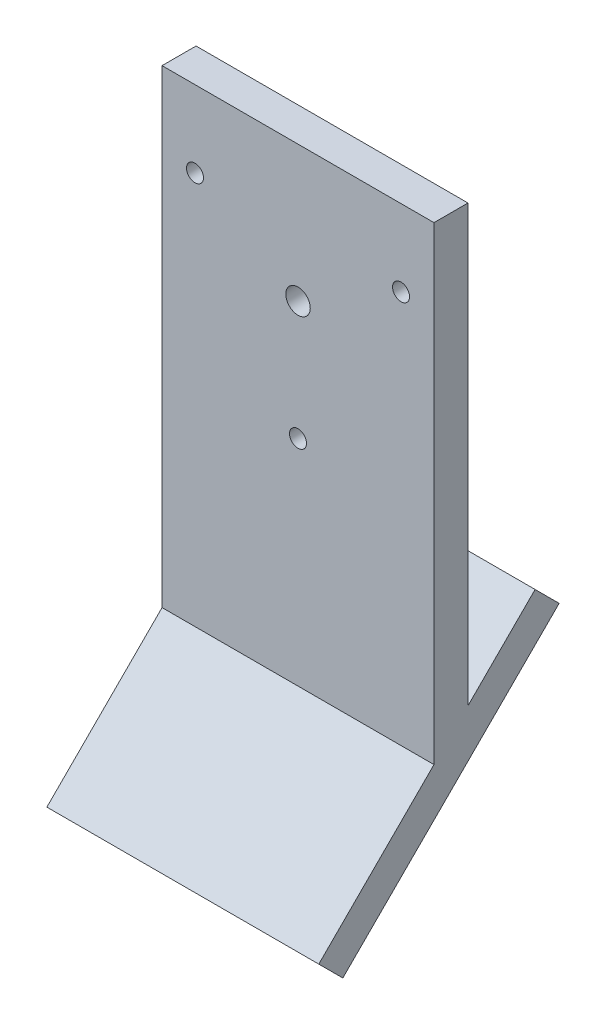
ISO-10303-21;
HEADER;
FILE_DESCRIPTION(('STEP AP214'),'2;1');
FILE_NAME('part.step','',(''),(''),'','','');
FILE_SCHEMA(('AUTOMOTIVE_DESIGN { 1 0 10303 214 1 1 1 1 }'));
ENDSEC;
DATA;
#1=APPLICATION_CONTEXT('core data for automotive mechanical design processes');
#2=APPLICATION_PROTOCOL_DEFINITION('international standard','automotive_design',2000,#1);
#3=PRODUCT_CONTEXT('',#1,'mechanical');
#4=PRODUCT('Part','Part','',(#3));
#5=PRODUCT_RELATED_PRODUCT_CATEGORY('part','',(#4));
#6=PRODUCT_DEFINITION_FORMATION('','',#4);
#7=PRODUCT_DEFINITION_CONTEXT('part definition',#1,'design');
#8=PRODUCT_DEFINITION('design','',#6,#7);
#9=PRODUCT_DEFINITION_SHAPE('','',#8);
#10=(LENGTH_UNIT() NAMED_UNIT(*) SI_UNIT(.MILLI.,.METRE.));
#11=(NAMED_UNIT(*) PLANE_ANGLE_UNIT() SI_UNIT($,.RADIAN.));
#12=(NAMED_UNIT(*) SI_UNIT($,.STERADIAN.) SOLID_ANGLE_UNIT());
#13=UNCERTAINTY_MEASURE_WITH_UNIT(LENGTH_MEASURE(1.E-05),#10,'distance_accuracy_value','');
#14=(GEOMETRIC_REPRESENTATION_CONTEXT(3) GLOBAL_UNCERTAINTY_ASSIGNED_CONTEXT((#13)) GLOBAL_UNIT_ASSIGNED_CONTEXT((#10,
#11,#12)) REPRESENTATION_CONTEXT('',''));
#15=CARTESIAN_POINT('',(0.,0.,0.));
#16=DIRECTION('',(0.,0.,1.));
#17=DIRECTION('',(1.,0.,0.));
#18=AXIS2_PLACEMENT_3D('',#15,#16,#17);
#19=CARTESIAN_POINT('',(20.,73.6133636546301,2.5));
#20=DIRECTION('',(0.,0.,-1.));
#21=DIRECTION('',(0.,1.,0.));
#22=AXIS2_PLACEMENT_3D('',#19,#20,#21);
#23=PLANE('',#22);
#24=CARTESIAN_POINT('',(15.1554445662277,62.3633636546301,2.49999999999999));
#25=DIRECTION('',(0.,0.,1.));
#26=DIRECTION('',(1.,0.,0.));
#27=AXIS2_PLACEMENT_3D('',#24,#25,#26);
#28=CIRCLE('',#27,1.24999999999999);
#29=CARTESIAN_POINT('',(16.4054445662277,62.3633636546301,2.49999999999999));
#30=VERTEX_POINT('',#29);
#31=EDGE_CURVE('E191',#30,#30,#28,.T.);
#32=ORIENTED_EDGE('',*,*,#31,.F.);
#33=EDGE_LOOP('',(#32));
#34=FACE_BOUND('',#33,.T.);
#35=CARTESIAN_POINT('',(0.,36.1133636546301,2.49999999999999));
#36=DIRECTION('',(0.,0.,1.));
#37=DIRECTION('',(1.,0.,0.));
#38=AXIS2_PLACEMENT_3D('',#35,#36,#37);
#39=CIRCLE('',#38,1.24999999999999);
#40=CARTESIAN_POINT('',(1.24999999999999,36.1133636546301,2.49999999999999));
#41=VERTEX_POINT('',#40);
#42=EDGE_CURVE('E185',#41,#41,#39,.T.);
#43=ORIENTED_EDGE('',*,*,#42,.F.);
#44=EDGE_LOOP('',(#43));
#45=FACE_BOUND('',#44,.T.);
#46=DIRECTION('',(0.,-1.,0.));
#47=VECTOR('',#46,1.);
#48=CARTESIAN_POINT('',(-20.,73.6133636546301,2.5));
#49=LINE('',#48,#47);
#50=CARTESIAN_POINT('',(-20.,73.6133636546301,2.5));
#51=VERTEX_POINT('',#50);
#52=CARTESIAN_POINT('',(-20.,4.57106781186549,2.49999999999999));
#53=VERTEX_POINT('',#52);
#54=EDGE_CURVE('E84',#51,#53,#49,.T.);
#55=ORIENTED_EDGE('',*,*,#54,.T.);
#56=DIRECTION('',(-1.,0.,0.));
#57=VECTOR('',#56,1.);
#58=CARTESIAN_POINT('',(20.,4.57106781186549,2.49999999999999));
#59=LINE('',#58,#57);
#60=CARTESIAN_POINT('',(20.,4.57106781186549,2.49999999999999));
#61=VERTEX_POINT('',#60);
#62=EDGE_CURVE('E127',#61,#53,#59,.T.);
#63=ORIENTED_EDGE('',*,*,#62,.F.);
#64=DIRECTION('',(0.,-1.,0.));
#65=VECTOR('',#64,1.);
#66=CARTESIAN_POINT('',(20.,73.6133636546301,2.5));
#67=LINE('',#66,#65);
#68=CARTESIAN_POINT('',(20.,73.6133636546301,2.5));
#69=VERTEX_POINT('',#68);
#70=EDGE_CURVE('E115',#69,#61,#67,.T.);
#71=ORIENTED_EDGE('',*,*,#70,.F.);
#72=DIRECTION('',(-1.,0.,0.));
#73=VECTOR('',#72,1.);
#74=CARTESIAN_POINT('',(20.,73.6133636546301,2.5));
#75=LINE('',#74,#73);
#76=EDGE_CURVE('E122',#69,#51,#75,.T.);
#77=ORIENTED_EDGE('',*,*,#76,.T.);
#78=EDGE_LOOP('',(#55,#63,#71,#77));
#79=FACE_BOUND('',#78,.T.);
#80=CARTESIAN_POINT('',(-15.1554445662277,62.3633636546301,2.49999999999999));
#81=DIRECTION('',(0.,0.,1.));
#82=DIRECTION('',(1.,0.,0.));
#83=AXIS2_PLACEMENT_3D('',#80,#81,#82);
#84=CIRCLE('',#83,1.24999999999999);
#85=CARTESIAN_POINT('',(-13.9054445662277,62.3633636546301,2.49999999999999));
#86=VERTEX_POINT('',#85);
#87=EDGE_CURVE('E197',#86,#86,#84,.T.);
#88=ORIENTED_EDGE('',*,*,#87,.F.);
#89=EDGE_LOOP('',(#88));
#90=FACE_BOUND('',#89,.T.);
#91=CARTESIAN_POINT('',(0.,53.6133636546301,2.49999999999999));
#92=DIRECTION('',(0.,0.,1.));
#93=DIRECTION('',(1.,0.,0.));
#94=AXIS2_PLACEMENT_3D('',#91,#92,#93);
#95=CIRCLE('',#94,1.8);
#96=CARTESIAN_POINT('',(1.8,53.6133636546301,2.49999999999999));
#97=VERTEX_POINT('',#96);
#98=EDGE_CURVE('E203',#97,#97,#95,.T.);
#99=ORIENTED_EDGE('',*,*,#98,.F.);
#100=EDGE_LOOP('',(#99));
#101=FACE_BOUND('',#100,.T.);
#102=ADVANCED_FACE('F38',(#34,#45,#79,#90,#101),#23,.F.);
#103=CARTESIAN_POINT('',(20.,-12.3743686707647,19.44543648263));
#104=DIRECTION('',(0.,0.707106781186552,-0.707106781186543));
#105=DIRECTION('',(0.,0.707106781186543,0.707106781186552));
#106=AXIS2_PLACEMENT_3D('',#103,#104,#105);
#107=PLANE('',#106);
#108=DIRECTION('',(0.,-0.707106781186543,-0.707106781186552));
#109=VECTOR('',#108,1.);
#110=CARTESIAN_POINT('',(-20.,-12.3743686707647,19.44543648263));
#111=LINE('',#110,#109);
#112=CARTESIAN_POINT('',(-20.,-12.3743686707647,19.44543648263));
#113=VERTEX_POINT('',#112);
#114=CARTESIAN_POINT('',(-20.,-15.9099025766974,15.9099025766972));
#115=VERTEX_POINT('',#114);
#116=EDGE_CURVE('E135',#113,#115,#111,.T.);
#117=ORIENTED_EDGE('',*,*,#116,.T.);
#118=DIRECTION('',(-1.,0.,0.));
#119=VECTOR('',#118,1.);
#120=CARTESIAN_POINT('',(20.,-15.9099025766974,15.9099025766972));
#121=LINE('',#120,#119);
#122=CARTESIAN_POINT('',(20.,-15.9099025766974,15.9099025766972));
#123=VERTEX_POINT('',#122);
#124=EDGE_CURVE('E11',#123,#115,#121,.T.);
#125=ORIENTED_EDGE('',*,*,#124,.F.);
#126=DIRECTION('',(0.,-0.707106781186543,-0.707106781186552));
#127=VECTOR('',#126,1.);
#128=CARTESIAN_POINT('',(20.,-12.3743686707647,19.44543648263));
#129=LINE('',#128,#127);
#130=CARTESIAN_POINT('',(20.,-12.3743686707647,19.44543648263));
#131=VERTEX_POINT('',#130);
#132=EDGE_CURVE('E150',#131,#123,#129,.T.);
#133=ORIENTED_EDGE('',*,*,#132,.F.);
#134=DIRECTION('',(-1.,0.,0.));
#135=VECTOR('',#134,1.);
#136=CARTESIAN_POINT('',(20.,-12.3743686707647,19.44543648263));
#137=LINE('',#136,#135);
#138=EDGE_CURVE('E131',#131,#113,#137,.T.);
#139=ORIENTED_EDGE('',*,*,#138,.T.);
#140=EDGE_LOOP('',(#117,#125,#133,#139));
#141=FACE_BOUND('',#140,.T.);
#142=ADVANCED_FACE('F40',(#141),#107,.F.);
#143=CARTESIAN_POINT('',(20.,-15.9099025766974,15.9099025766972));
#144=DIRECTION('',(0.,0.707106781186544,0.707106781186551));
#145=DIRECTION('',(0.,-0.707106781186551,0.707106781186544));
#146=AXIS2_PLACEMENT_3D('',#143,#144,#145);
#147=PLANE('',#146);
#148=DIRECTION('',(0.,0.707106781186551,-0.707106781186544));
#149=VECTOR('',#148,1.);
#150=CARTESIAN_POINT('',(-20.,-15.9099025766974,15.9099025766972));
#151=LINE('',#150,#149);
#152=CARTESIAN_POINT('',(-20.,15.9099025766974,-15.9099025766972));
#153=VERTEX_POINT('',#152);
#154=EDGE_CURVE('E138',#115,#153,#151,.T.);
#155=ORIENTED_EDGE('',*,*,#154,.T.);
#156=DIRECTION('',(-1.,0.,0.));
#157=VECTOR('',#156,1.);
#158=CARTESIAN_POINT('',(20.,15.9099025766974,-15.9099025766972));
#159=LINE('',#158,#157);
#160=CARTESIAN_POINT('',(20.,15.9099025766974,-15.9099025766972));
#161=VERTEX_POINT('',#160);
#162=EDGE_CURVE('E47',#161,#153,#159,.T.);
#163=ORIENTED_EDGE('',*,*,#162,.F.);
#164=DIRECTION('',(0.,0.707106781186551,-0.707106781186544));
#165=VECTOR('',#164,1.);
#166=CARTESIAN_POINT('',(20.,-15.9099025766974,15.9099025766972));
#167=LINE('',#166,#165);
#168=EDGE_CURVE('E98',#123,#161,#167,.T.);
#169=ORIENTED_EDGE('',*,*,#168,.F.);
#170=ORIENTED_EDGE('',*,*,#124,.T.);
#171=EDGE_LOOP('',(#155,#163,#169,#170));
#172=FACE_BOUND('',#171,.T.);
#173=ADVANCED_FACE('F217',(#172),#147,.F.);
#174=CARTESIAN_POINT('',(20.,15.9099025766974,-15.9099025766972));
#175=DIRECTION('',(0.,-0.707106781186549,0.707106781186546));
#176=DIRECTION('',(0.,-0.707106781186546,-0.707106781186549));
#177=AXIS2_PLACEMENT_3D('',#174,#175,#176);
#178=PLANE('',#177);
#179=DIRECTION('',(0.,0.707106781186546,0.707106781186549));
#180=VECTOR('',#179,1.);
#181=CARTESIAN_POINT('',(-20.,15.9099025766974,-15.9099025766972));
#182=LINE('',#181,#180);
#183=CARTESIAN_POINT('',(-20.,19.4454364826301,-12.3743686707645));
#184=VERTEX_POINT('',#183);
#185=EDGE_CURVE('E141',#153,#184,#182,.T.);
#186=ORIENTED_EDGE('',*,*,#185,.T.);
#187=DIRECTION('',(-1.,0.,0.));
#188=VECTOR('',#187,1.);
#189=CARTESIAN_POINT('',(20.,19.4454364826301,-12.3743686707645));
#190=LINE('',#189,#188);
#191=CARTESIAN_POINT('',(20.,19.4454364826301,-12.3743686707645));
#192=VERTEX_POINT('',#191);
#193=EDGE_CURVE('E157',#192,#184,#190,.T.);
#194=ORIENTED_EDGE('',*,*,#193,.F.);
#195=DIRECTION('',(0.,0.707106781186546,0.707106781186549));
#196=VECTOR('',#195,1.);
#197=CARTESIAN_POINT('',(20.,15.9099025766974,-15.9099025766972));
#198=LINE('',#197,#196);
#199=EDGE_CURVE('E165',#161,#192,#198,.T.);
#200=ORIENTED_EDGE('',*,*,#199,.F.);
#201=ORIENTED_EDGE('',*,*,#162,.T.);
#202=EDGE_LOOP('',(#186,#194,#200,#201));
#203=FACE_BOUND('',#202,.T.);
#204=ADVANCED_FACE('F163',(#203),#178,.F.);
#205=CARTESIAN_POINT('',(20.,19.4454364826301,-12.3743686707645));
#206=DIRECTION('',(0.,-0.707106781186543,-0.707106781186552));
#207=DIRECTION('',(0.,0.707106781186552,-0.707106781186543));
#208=AXIS2_PLACEMENT_3D('',#205,#206,#207);
#209=PLANE('',#208);
#210=DIRECTION('',(0.,-0.707106781186552,0.707106781186543));
#211=VECTOR('',#210,1.);
#212=CARTESIAN_POINT('',(-20.,19.4454364826301,-12.3743686707645));
#213=LINE('',#212,#211);
#214=CARTESIAN_POINT('',(-20.,9.57106781186554,-2.5));
#215=VERTEX_POINT('',#214);
#216=EDGE_CURVE('E143',#184,#215,#213,.T.);
#217=ORIENTED_EDGE('',*,*,#216,.T.);
#218=DIRECTION('',(-1.,0.,0.));
#219=VECTOR('',#218,1.);
#220=CARTESIAN_POINT('',(20.,9.57106781186554,-2.5));
#221=LINE('',#220,#219);
#222=CARTESIAN_POINT('',(20.,9.57106781186554,-2.5));
#223=VERTEX_POINT('',#222);
#224=EDGE_CURVE('E154',#223,#215,#221,.T.);
#225=ORIENTED_EDGE('',*,*,#224,.F.);
#226=DIRECTION('',(0.,-0.707106781186552,0.707106781186543));
#227=VECTOR('',#226,1.);
#228=CARTESIAN_POINT('',(20.,19.4454364826301,-12.3743686707645));
#229=LINE('',#228,#227);
#230=EDGE_CURVE('E177',#192,#223,#229,.T.);
#231=ORIENTED_EDGE('',*,*,#230,.F.);
#232=ORIENTED_EDGE('',*,*,#193,.T.);
#233=EDGE_LOOP('',(#217,#225,#231,#232));
#234=FACE_BOUND('',#233,.T.);
#235=ADVANCED_FACE('F173',(#234),#209,.F.);
#236=CARTESIAN_POINT('',(20.,9.57106781186554,-2.5));
#237=DIRECTION('',(0.,0.,1.));
#238=DIRECTION('',(1.,0.,0.));
#239=AXIS2_PLACEMENT_3D('',#236,#237,#238);
#240=PLANE('',#239);
#241=CARTESIAN_POINT('',(0.,53.6133636546301,-2.5));
#242=DIRECTION('',(0.,0.,1.));
#243=DIRECTION('',(1.,0.,0.));
#244=AXIS2_PLACEMENT_3D('',#241,#242,#243);
#245=CIRCLE('',#244,1.8);
#246=CARTESIAN_POINT('',(1.8,53.6133636546301,-2.5));
#247=VERTEX_POINT('',#246);
#248=EDGE_CURVE('E200',#247,#247,#245,.T.);
#249=ORIENTED_EDGE('',*,*,#248,.T.);
#250=EDGE_LOOP('',(#249));
#251=FACE_BOUND('',#250,.T.);
#252=CARTESIAN_POINT('',(-15.1554445662277,62.3633636546301,-2.5));
#253=DIRECTION('',(0.,0.,1.));
#254=DIRECTION('',(1.,0.,0.));
#255=AXIS2_PLACEMENT_3D('',#252,#253,#254);
#256=CIRCLE('',#255,1.24999999999999);
#257=CARTESIAN_POINT('',(-13.9054445662277,62.3633636546301,-2.5));
#258=VERTEX_POINT('',#257);
#259=EDGE_CURVE('E194',#258,#258,#256,.T.);
#260=ORIENTED_EDGE('',*,*,#259,.T.);
#261=EDGE_LOOP('',(#260));
#262=FACE_BOUND('',#261,.T.);
#263=CARTESIAN_POINT('',(15.1554445662277,62.3633636546301,-2.5));
#264=DIRECTION('',(0.,0.,1.));
#265=DIRECTION('',(1.,0.,0.));
#266=AXIS2_PLACEMENT_3D('',#263,#264,#265);
#267=CIRCLE('',#266,1.24999999999999);
#268=CARTESIAN_POINT('',(16.4054445662277,62.3633636546301,-2.5));
#269=VERTEX_POINT('',#268);
#270=EDGE_CURVE('E188',#269,#269,#267,.T.);
#271=ORIENTED_EDGE('',*,*,#270,.T.);
#272=EDGE_LOOP('',(#271));
#273=FACE_BOUND('',#272,.T.);
#274=CARTESIAN_POINT('',(0.,36.1133636546301,-2.5));
#275=DIRECTION('',(0.,0.,1.));
#276=DIRECTION('',(1.,0.,0.));
#277=AXIS2_PLACEMENT_3D('',#274,#275,#276);
#278=CIRCLE('',#277,1.24999999999999);
#279=CARTESIAN_POINT('',(1.25,36.1133636546301,-2.5));
#280=VERTEX_POINT('',#279);
#281=EDGE_CURVE('E139',#280,#280,#278,.T.);
#282=ORIENTED_EDGE('',*,*,#281,.T.);
#283=EDGE_LOOP('',(#282));
#284=FACE_BOUND('',#283,.T.);
#285=DIRECTION('',(0.,1.,0.));
#286=VECTOR('',#285,1.);
#287=CARTESIAN_POINT('',(-20.,9.57106781186554,-2.5));
#288=LINE('',#287,#286);
#289=CARTESIAN_POINT('',(-20.,73.6133636546301,-2.5));
#290=VERTEX_POINT('',#289);
#291=EDGE_CURVE('E145',#215,#290,#288,.T.);
#292=ORIENTED_EDGE('',*,*,#291,.T.);
#293=DIRECTION('',(-1.,0.,0.));
#294=VECTOR('',#293,1.);
#295=CARTESIAN_POINT('',(20.,73.6133636546301,-2.5));
#296=LINE('',#295,#294);
#297=CARTESIAN_POINT('',(20.,73.6133636546301,-2.5));
#298=VERTEX_POINT('',#297);
#299=EDGE_CURVE('E126',#298,#290,#296,.T.);
#300=ORIENTED_EDGE('',*,*,#299,.F.);
#301=DIRECTION('',(0.,1.,0.));
#302=VECTOR('',#301,1.);
#303=CARTESIAN_POINT('',(20.,9.57106781186554,-2.5));
#304=LINE('',#303,#302);
#305=EDGE_CURVE('E117',#223,#298,#304,.T.);
#306=ORIENTED_EDGE('',*,*,#305,.F.);
#307=ORIENTED_EDGE('',*,*,#224,.T.);
#308=EDGE_LOOP('',(#292,#300,#306,#307));
#309=FACE_BOUND('',#308,.T.);
#310=ADVANCED_FACE('F176',(#251,#262,#273,#284,#309),#240,.F.);
#311=CARTESIAN_POINT('',(20.,73.6133636546301,-2.5));
#312=DIRECTION('',(0.,-1.,0.));
#313=DIRECTION('',(0.,0.,-1.));
#314=AXIS2_PLACEMENT_3D('',#311,#312,#313);
#315=PLANE('',#314);
#316=DIRECTION('',(0.,0.,1.));
#317=VECTOR('',#316,1.);
#318=CARTESIAN_POINT('',(-20.,73.6133636546301,-2.5));
#319=LINE('',#318,#317);
#320=EDGE_CURVE('E125',#290,#51,#319,.T.);
#321=ORIENTED_EDGE('',*,*,#320,.T.);
#322=ORIENTED_EDGE('',*,*,#76,.F.);
#323=DIRECTION('',(0.,0.,1.));
#324=VECTOR('',#323,1.);
#325=CARTESIAN_POINT('',(20.,73.6133636546301,-2.5));
#326=LINE('',#325,#324);
#327=EDGE_CURVE('E111',#298,#69,#326,.T.);
#328=ORIENTED_EDGE('',*,*,#327,.F.);
#329=ORIENTED_EDGE('',*,*,#299,.T.);
#330=EDGE_LOOP('',(#321,#322,#328,#329));
#331=FACE_BOUND('',#330,.T.);
#332=ADVANCED_FACE('F123',(#331),#315,.F.);
#333=CARTESIAN_POINT('',(20.,4.57106781186549,2.49999999999999));
#334=DIRECTION('',(0.,-0.707106781186543,-0.707106781186552));
#335=DIRECTION('',(0.,0.707106781186552,-0.707106781186543));
#336=AXIS2_PLACEMENT_3D('',#333,#334,#335);
#337=PLANE('',#336);
#338=DIRECTION('',(0.,-0.707106781186551,0.707106781186543));
#339=VECTOR('',#338,1.);
#340=CARTESIAN_POINT('',(-20.,4.57106781186549,2.49999999999999));
#341=LINE('',#340,#339);
#342=EDGE_CURVE('E90',#53,#113,#341,.T.);
#343=ORIENTED_EDGE('',*,*,#342,.T.);
#344=ORIENTED_EDGE('',*,*,#138,.F.);
#345=DIRECTION('',(0.,-0.707106781186551,0.707106781186543));
#346=VECTOR('',#345,1.);
#347=CARTESIAN_POINT('',(20.,4.57106781186549,2.49999999999999));
#348=LINE('',#347,#346);
#349=EDGE_CURVE('E55',#61,#131,#348,.T.);
#350=ORIENTED_EDGE('',*,*,#349,.F.);
#351=ORIENTED_EDGE('',*,*,#62,.T.);
#352=EDGE_LOOP('',(#343,#344,#350,#351));
#353=FACE_BOUND('',#352,.T.);
#354=ADVANCED_FACE('F223',(#353),#337,.F.);
#355=CARTESIAN_POINT('',(20.,0.,0.));
#356=DIRECTION('',(1.,0.,0.));
#357=DIRECTION('',(0.,0.,-1.));
#358=AXIS2_PLACEMENT_3D('',#355,#356,#357);
#359=PLANE('',#358);
#360=ORIENTED_EDGE('',*,*,#132,.T.);
#361=ORIENTED_EDGE('',*,*,#168,.T.);
#362=ORIENTED_EDGE('',*,*,#199,.T.);
#363=ORIENTED_EDGE('',*,*,#230,.T.);
#364=ORIENTED_EDGE('',*,*,#305,.T.);
#365=ORIENTED_EDGE('',*,*,#327,.T.);
#366=ORIENTED_EDGE('',*,*,#70,.T.);
#367=ORIENTED_EDGE('',*,*,#349,.T.);
#368=EDGE_LOOP('',(#360,#361,#362,#363,#364,#365,#366,#367));
#369=FACE_BOUND('',#368,.T.);
#370=ADVANCED_FACE('F113',(#369),#359,.T.);
#371=CARTESIAN_POINT('',(-20.,0.,0.));
#372=DIRECTION('',(1.,0.,0.));
#373=DIRECTION('',(0.,0.,-1.));
#374=AXIS2_PLACEMENT_3D('',#371,#372,#373);
#375=PLANE('',#374);
#376=ORIENTED_EDGE('',*,*,#116,.F.);
#377=ORIENTED_EDGE('',*,*,#342,.F.);
#378=ORIENTED_EDGE('',*,*,#54,.F.);
#379=ORIENTED_EDGE('',*,*,#320,.F.);
#380=ORIENTED_EDGE('',*,*,#291,.F.);
#381=ORIENTED_EDGE('',*,*,#216,.F.);
#382=ORIENTED_EDGE('',*,*,#185,.F.);
#383=ORIENTED_EDGE('',*,*,#154,.F.);
#384=EDGE_LOOP('',(#376,#377,#378,#379,#380,#381,#382,#383));
#385=FACE_BOUND('',#384,.T.);
#386=ADVANCED_FACE('F169',(#385),#375,.F.);
#387=CARTESIAN_POINT('',(0.,36.1133636546301,2.49999999999999));
#388=DIRECTION('',(0.,0.,1.));
#389=DIRECTION('',(1.,0.,0.));
#390=AXIS2_PLACEMENT_3D('',#387,#388,#389);
#391=CYLINDRICAL_SURFACE('',#390,1.24999999999999);
#392=ORIENTED_EDGE('',*,*,#281,.F.);
#393=EDGE_LOOP('',(#392));
#394=FACE_BOUND('',#393,.T.);
#395=ORIENTED_EDGE('',*,*,#42,.T.);
#396=EDGE_LOOP('',(#395));
#397=FACE_BOUND('',#396,.T.);
#398=ADVANCED_FACE('F245',(#394,#397),#391,.F.);
#399=CARTESIAN_POINT('',(15.1554445662277,62.3633636546301,2.49999999999999));
#400=DIRECTION('',(0.,0.,1.));
#401=DIRECTION('',(1.,0.,0.));
#402=AXIS2_PLACEMENT_3D('',#399,#400,#401);
#403=CYLINDRICAL_SURFACE('',#402,1.24999999999999);
#404=ORIENTED_EDGE('',*,*,#270,.F.);
#405=EDGE_LOOP('',(#404));
#406=FACE_BOUND('',#405,.T.);
#407=ORIENTED_EDGE('',*,*,#31,.T.);
#408=EDGE_LOOP('',(#407));
#409=FACE_BOUND('',#408,.T.);
#410=ADVANCED_FACE('F249',(#406,#409),#403,.F.);
#411=CARTESIAN_POINT('',(-15.1554445662277,62.3633636546301,2.49999999999999));
#412=DIRECTION('',(0.,0.,1.));
#413=DIRECTION('',(1.,0.,0.));
#414=AXIS2_PLACEMENT_3D('',#411,#412,#413);
#415=CYLINDRICAL_SURFACE('',#414,1.24999999999999);
#416=ORIENTED_EDGE('',*,*,#259,.F.);
#417=EDGE_LOOP('',(#416));
#418=FACE_BOUND('',#417,.T.);
#419=ORIENTED_EDGE('',*,*,#87,.T.);
#420=EDGE_LOOP('',(#419));
#421=FACE_BOUND('',#420,.T.);
#422=ADVANCED_FACE('F253',(#418,#421),#415,.F.);
#423=CARTESIAN_POINT('',(0.,53.6133636546301,2.49999999999999));
#424=DIRECTION('',(0.,0.,1.));
#425=DIRECTION('',(1.,0.,0.));
#426=AXIS2_PLACEMENT_3D('',#423,#424,#425);
#427=CYLINDRICAL_SURFACE('',#426,1.8);
#428=ORIENTED_EDGE('',*,*,#248,.F.);
#429=EDGE_LOOP('',(#428));
#430=FACE_BOUND('',#429,.T.);
#431=ORIENTED_EDGE('',*,*,#98,.T.);
#432=EDGE_LOOP('',(#431));
#433=FACE_BOUND('',#432,.T.);
#434=ADVANCED_FACE('F207',(#430,#433),#427,.F.);
#435=CLOSED_SHELL('',(#102,#142,#173,#204,#235,#310,#332,#354,#370,#386,#398,#410,#422,#434));
#436=MANIFOLD_SOLID_BREP('B2',#435);
#437=ADVANCED_BREP_SHAPE_REPRESENTATION('',(#18,#436),#14);
#438=SHAPE_DEFINITION_REPRESENTATION(#9,#437);
ENDSEC;
END-ISO-10303-21;
